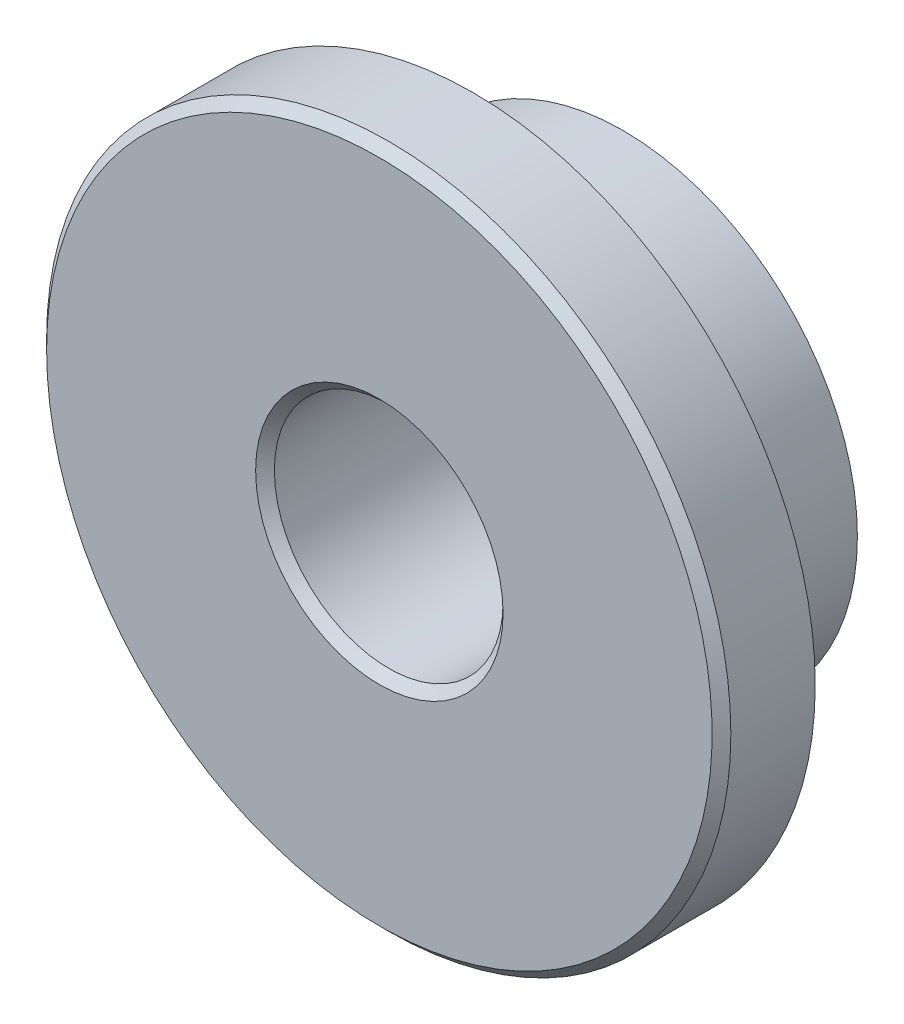
ISO-10303-21;
HEADER;
FILE_DESCRIPTION(('STEP AP214'),'2;1');
FILE_NAME('part.step','',(''),(''),'','','');
FILE_SCHEMA(('AUTOMOTIVE_DESIGN { 1 0 10303 214 1 1 1 1 }'));
ENDSEC;
DATA;
#1=APPLICATION_CONTEXT('core data for automotive mechanical design processes');
#2=APPLICATION_PROTOCOL_DEFINITION('international standard','automotive_design',2000,#1);
#3=PRODUCT_CONTEXT('',#1,'mechanical');
#4=PRODUCT('Part','Part','',(#3));
#5=PRODUCT_RELATED_PRODUCT_CATEGORY('part','',(#4));
#6=PRODUCT_DEFINITION_FORMATION('','',#4);
#7=PRODUCT_DEFINITION_CONTEXT('part definition',#1,'design');
#8=PRODUCT_DEFINITION('design','',#6,#7);
#9=PRODUCT_DEFINITION_SHAPE('','',#8);
#10=(LENGTH_UNIT() NAMED_UNIT(*) SI_UNIT(.MILLI.,.METRE.));
#11=(NAMED_UNIT(*) PLANE_ANGLE_UNIT() SI_UNIT($,.RADIAN.));
#12=(NAMED_UNIT(*) SI_UNIT($,.STERADIAN.) SOLID_ANGLE_UNIT());
#13=UNCERTAINTY_MEASURE_WITH_UNIT(LENGTH_MEASURE(1.E-05),#10,'distance_accuracy_value','');
#14=(GEOMETRIC_REPRESENTATION_CONTEXT(3) GLOBAL_UNCERTAINTY_ASSIGNED_CONTEXT((#13)) GLOBAL_UNIT_ASSIGNED_CONTEXT((#10,
#11,#12)) REPRESENTATION_CONTEXT('',''));
#15=CARTESIAN_POINT('',(0.,0.,0.));
#16=DIRECTION('',(0.,0.,1.));
#17=DIRECTION('',(1.,0.,0.));
#18=AXIS2_PLACEMENT_3D('',#15,#16,#17);
#19=CARTESIAN_POINT('',(0.,0.,-8.));
#20=DIRECTION('',(0.,0.,1.));
#21=DIRECTION('',(1.,0.,0.));
#22=AXIS2_PLACEMENT_3D('',#19,#20,#21);
#23=PLANE('',#22);
#24=CARTESIAN_POINT('',(0.,0.,-8.));
#25=DIRECTION('',(0.,0.,-1.));
#26=DIRECTION('',(-1.,0.,0.));
#27=AXIS2_PLACEMENT_3D('',#24,#25,#26);
#28=CIRCLE('',#27,9.);
#29=CARTESIAN_POINT('',(-9.,0.,-8.));
#30=VERTEX_POINT('',#29);
#31=EDGE_CURVE('E18',#30,#30,#28,.T.);
#32=ORIENTED_EDGE('',*,*,#31,.F.);
#33=EDGE_LOOP('',(#32));
#34=FACE_BOUND('',#33,.T.);
#35=CARTESIAN_POINT('',(0.,0.,-8.));
#36=DIRECTION('',(0.,0.,-1.));
#37=DIRECTION('',(-1.,0.,0.));
#38=AXIS2_PLACEMENT_3D('',#35,#36,#37);
#39=CIRCLE('',#38,12.5);
#40=CARTESIAN_POINT('',(-12.5,0.,-8.));
#41=VERTEX_POINT('',#40);
#42=EDGE_CURVE('E45',#41,#41,#39,.F.);
#43=ORIENTED_EDGE('',*,*,#42,.F.);
#44=EDGE_LOOP('',(#43));
#45=FACE_BOUND('',#44,.T.);
#46=ADVANCED_FACE('F15',(#34,#45),#23,.F.);
#47=CARTESIAN_POINT('',(0.,0.,-8.));
#48=DIRECTION('',(0.,0.,-1.));
#49=DIRECTION('',(-1.,0.,0.));
#50=AXIS2_PLACEMENT_3D('',#47,#48,#49);
#51=CYLINDRICAL_SURFACE('',#50,9.);
#52=ORIENTED_EDGE('',*,*,#31,.T.);
#53=EDGE_LOOP('',(#52));
#54=FACE_BOUND('',#53,.T.);
#55=CARTESIAN_POINT('',(0.,0.,-9.));
#56=DIRECTION('',(0.,0.,-1.));
#57=DIRECTION('',(-1.,0.,0.));
#58=AXIS2_PLACEMENT_3D('',#55,#56,#57);
#59=CIRCLE('',#58,9.);
#60=CARTESIAN_POINT('',(-9.,0.,-9.));
#61=VERTEX_POINT('',#60);
#62=EDGE_CURVE('E43',#61,#61,#59,.F.);
#63=ORIENTED_EDGE('',*,*,#62,.T.);
#64=EDGE_LOOP('',(#63));
#65=FACE_BOUND('',#64,.T.);
#66=ADVANCED_FACE('F52',(#54,#65),#51,.T.);
#67=CARTESIAN_POINT('',(0.,0.,0.));
#68=DIRECTION('',(0.,0.,-1.));
#69=DIRECTION('',(-1.,0.,0.));
#70=AXIS2_PLACEMENT_3D('',#67,#68,#69);
#71=CYLINDRICAL_SURFACE('',#70,12.5);
#72=CARTESIAN_POINT('',(0.,0.,0.));
#73=DIRECTION('',(0.,0.,-1.));
#74=DIRECTION('',(-1.,0.,0.));
#75=AXIS2_PLACEMENT_3D('',#72,#73,#74);
#76=CIRCLE('',#75,12.5);
#77=CARTESIAN_POINT('',(-12.5,0.,0.));
#78=VERTEX_POINT('',#77);
#79=EDGE_CURVE('E40',#78,#78,#76,.F.);
#80=ORIENTED_EDGE('',*,*,#79,.F.);
#81=EDGE_LOOP('',(#80));
#82=FACE_BOUND('',#81,.T.);
#83=ORIENTED_EDGE('',*,*,#42,.T.);
#84=EDGE_LOOP('',(#83));
#85=FACE_BOUND('',#84,.T.);
#86=ADVANCED_FACE('F61',(#82,#85),#71,.T.);
#87=CARTESIAN_POINT('',(0.,0.,-9.));
#88=DIRECTION('',(0.,0.,1.));
#89=DIRECTION('',(1.,0.,0.));
#90=AXIS2_PLACEMENT_3D('',#87,#88,#89);
#91=PLANE('',#90);
#92=CARTESIAN_POINT('',(0.,0.,-9.00000000024193));
#93=DIRECTION('',(0.,0.,-1.));
#94=DIRECTION('',(-1.,0.,0.));
#95=AXIS2_PLACEMENT_3D('',#92,#93,#94);
#96=CIRCLE('',#95,6.59999999976435);
#97=CARTESIAN_POINT('',(-6.59999999976435,0.,-9.00000000024193));
#98=VERTEX_POINT('',#97);
#99=EDGE_CURVE('E37',#98,#98,#96,.F.);
#100=ORIENTED_EDGE('',*,*,#99,.T.);
#101=EDGE_LOOP('',(#100));
#102=FACE_BOUND('',#101,.T.);
#103=ORIENTED_EDGE('',*,*,#62,.F.);
#104=EDGE_LOOP('',(#103));
#105=FACE_BOUND('',#104,.T.);
#106=ADVANCED_FACE('F92',(#102,#105),#91,.F.);
#107=CARTESIAN_POINT('',(0.,0.,0.));
#108=DIRECTION('',(0.,0.,-1.));
#109=DIRECTION('',(-1.,0.,0.));
#110=AXIS2_PLACEMENT_3D('',#107,#108,#109);
#111=PLANE('',#110);
#112=ORIENTED_EDGE('',*,*,#79,.T.);
#113=EDGE_LOOP('',(#112));
#114=FACE_BOUND('',#113,.T.);
#115=CARTESIAN_POINT('',(0.,0.,0.));
#116=DIRECTION('',(0.,0.,1.));
#117=DIRECTION('',(1.,0.,0.));
#118=AXIS2_PLACEMENT_3D('',#115,#116,#117);
#119=CIRCLE('',#118,18.25);
#120=CARTESIAN_POINT('',(18.25,0.,0.));
#121=VERTEX_POINT('',#120);
#122=EDGE_CURVE('E33',#121,#121,#119,.T.);
#123=ORIENTED_EDGE('',*,*,#122,.F.);
#124=EDGE_LOOP('',(#123));
#125=FACE_BOUND('',#124,.T.);
#126=ADVANCED_FACE('F88',(#114,#125),#111,.T.);
#127=CARTESIAN_POINT('',(0.,0.,-9.00000000024193));
#128=DIRECTION('',(0.,0.,-1.));
#129=DIRECTION('',(-1.,0.,0.));
#130=AXIS2_PLACEMENT_3D('',#127,#128,#129);
#131=CONICAL_SURFACE('',#130,6.59999999976435,0.78539816243111);
#132=ORIENTED_EDGE('',*,*,#99,.F.);
#133=EDGE_LOOP('',(#132));
#134=FACE_BOUND('',#133,.T.);
#135=CARTESIAN_POINT('',(0.,0.,-8.5));
#136=DIRECTION('',(0.,0.,1.));
#137=DIRECTION('',(1.,0.,0.));
#138=AXIS2_PLACEMENT_3D('',#135,#136,#137);
#139=CIRCLE('',#138,6.1);
#140=CARTESIAN_POINT('',(6.1,0.,-8.5));
#141=VERTEX_POINT('',#140);
#142=EDGE_CURVE('E36',#141,#141,#139,.T.);
#143=ORIENTED_EDGE('',*,*,#142,.T.);
#144=EDGE_LOOP('',(#143));
#145=FACE_BOUND('',#144,.T.);
#146=ADVANCED_FACE('F84',(#134,#145),#131,.F.);
#147=CARTESIAN_POINT('',(0.,0.,0.));
#148=DIRECTION('',(0.,0.,1.));
#149=DIRECTION('',(1.,0.,0.));
#150=AXIS2_PLACEMENT_3D('',#147,#148,#149);
#151=CYLINDRICAL_SURFACE('',#150,18.25);
#152=CARTESIAN_POINT('',(0.,0.,4.49999999977564));
#153=DIRECTION('',(0.,0.,-1.));
#154=DIRECTION('',(-1.,0.,0.));
#155=AXIS2_PLACEMENT_3D('',#152,#153,#154);
#156=CIRCLE('',#155,18.2499999997756);
#157=CARTESIAN_POINT('',(-18.2499999997756,0.,4.49999999977564));
#158=VERTEX_POINT('',#157);
#159=EDGE_CURVE('E178',#158,#158,#156,.F.);
#160=ORIENTED_EDGE('',*,*,#159,.F.);
#161=EDGE_LOOP('',(#160));
#162=FACE_BOUND('',#161,.T.);
#163=ORIENTED_EDGE('',*,*,#122,.T.);
#164=EDGE_LOOP('',(#163));
#165=FACE_BOUND('',#164,.T.);
#166=ADVANCED_FACE('F80',(#162,#165),#151,.T.);
#167=CARTESIAN_POINT('',(0.,0.,-46.8603895087571));
#168=DIRECTION('',(0.,0.,1.));
#169=DIRECTION('',(1.,0.,0.));
#170=AXIS2_PLACEMENT_3D('',#167,#168,#169);
#171=CYLINDRICAL_SURFACE('',#170,6.1);
#172=ORIENTED_EDGE('',*,*,#142,.F.);
#173=EDGE_LOOP('',(#172));
#174=FACE_BOUND('',#173,.T.);
#175=CARTESIAN_POINT('',(0.,0.,4.49999999972306));
#176=DIRECTION('',(0.,0.,1.));
#177=DIRECTION('',(-1.,0.,0.));
#178=AXIS2_PLACEMENT_3D('',#175,#176,#177);
#179=CIRCLE('',#178,6.10000000023092);
#180=CARTESIAN_POINT('',(-6.10000000023092,0.,4.49999999972306));
#181=VERTEX_POINT('',#180);
#182=EDGE_CURVE('E27',#181,#181,#179,.T.);
#183=ORIENTED_EDGE('',*,*,#182,.T.);
#184=EDGE_LOOP('',(#183));
#185=FACE_BOUND('',#184,.T.);
#186=ADVANCED_FACE('F76',(#174,#185),#171,.F.);
#187=CARTESIAN_POINT('',(0.,0.,4.49999999977564));
#188=DIRECTION('',(0.,0.,-1.));
#189=DIRECTION('',(-1.,0.,0.));
#190=AXIS2_PLACEMENT_3D('',#187,#188,#189);
#191=CONICAL_SURFACE('',#190,18.2499999997756,0.785398162500001);
#192=ORIENTED_EDGE('',*,*,#159,.T.);
#193=EDGE_LOOP('',(#192));
#194=FACE_BOUND('',#193,.T.);
#195=CARTESIAN_POINT('',(0.,0.,5.00000000022436));
#196=DIRECTION('',(0.,0.,-1.));
#197=DIRECTION('',(-1.,0.,0.));
#198=AXIS2_PLACEMENT_3D('',#195,#196,#197);
#199=CIRCLE('',#198,17.7500000002244);
#200=CARTESIAN_POINT('',(-17.7500000002244,0.,5.00000000022436));
#201=VERTEX_POINT('',#200);
#202=EDGE_CURVE('E22',#201,#201,#199,.T.);
#203=ORIENTED_EDGE('',*,*,#202,.T.);
#204=EDGE_LOOP('',(#203));
#205=FACE_BOUND('',#204,.T.);
#206=ADVANCED_FACE('F70',(#194,#205),#191,.T.);
#207=CARTESIAN_POINT('',(0.,0.,5.00000000022283));
#208=DIRECTION('',(0.,0.,1.));
#209=DIRECTION('',(1.,0.,0.));
#210=AXIS2_PLACEMENT_3D('',#207,#208,#209);
#211=CONICAL_SURFACE('',#210,6.59999999982119,0.785398162487954);
#212=CARTESIAN_POINT('',(0.,0.,5.00000000022283));
#213=DIRECTION('',(0.,0.,1.));
#214=DIRECTION('',(1.,0.,0.));
#215=AXIS2_PLACEMENT_3D('',#212,#213,#214);
#216=CIRCLE('',#215,6.59999999982119);
#217=CARTESIAN_POINT('',(6.59999999982119,0.,5.00000000022283));
#218=VERTEX_POINT('',#217);
#219=EDGE_CURVE('E10',#218,#218,#216,.T.);
#220=ORIENTED_EDGE('',*,*,#219,.T.);
#221=EDGE_LOOP('',(#220));
#222=FACE_BOUND('',#221,.T.);
#223=ORIENTED_EDGE('',*,*,#182,.F.);
#224=EDGE_LOOP('',(#223));
#225=FACE_BOUND('',#224,.T.);
#226=ADVANCED_FACE('F64',(#222,#225),#211,.F.);
#227=CARTESIAN_POINT('',(0.,0.,5.));
#228=DIRECTION('',(0.,0.,-1.));
#229=DIRECTION('',(-1.,0.,0.));
#230=AXIS2_PLACEMENT_3D('',#227,#228,#229);
#231=PLANE('',#230);
#232=ORIENTED_EDGE('',*,*,#219,.F.);
#233=EDGE_LOOP('',(#232));
#234=FACE_BOUND('',#233,.T.);
#235=ORIENTED_EDGE('',*,*,#202,.F.);
#236=EDGE_LOOP('',(#235));
#237=FACE_BOUND('',#236,.T.);
#238=ADVANCED_FACE('F62',(#234,#237),#231,.F.);
#239=CLOSED_SHELL('',(#46,#66,#86,#106,#126,#146,#166,#186,#206,#226,#238));
#240=MANIFOLD_SOLID_BREP('B1',#239);
#241=ADVANCED_BREP_SHAPE_REPRESENTATION('',(#18,#240),#14);
#242=SHAPE_DEFINITION_REPRESENTATION(#9,#241);
ENDSEC;
END-ISO-10303-21;
